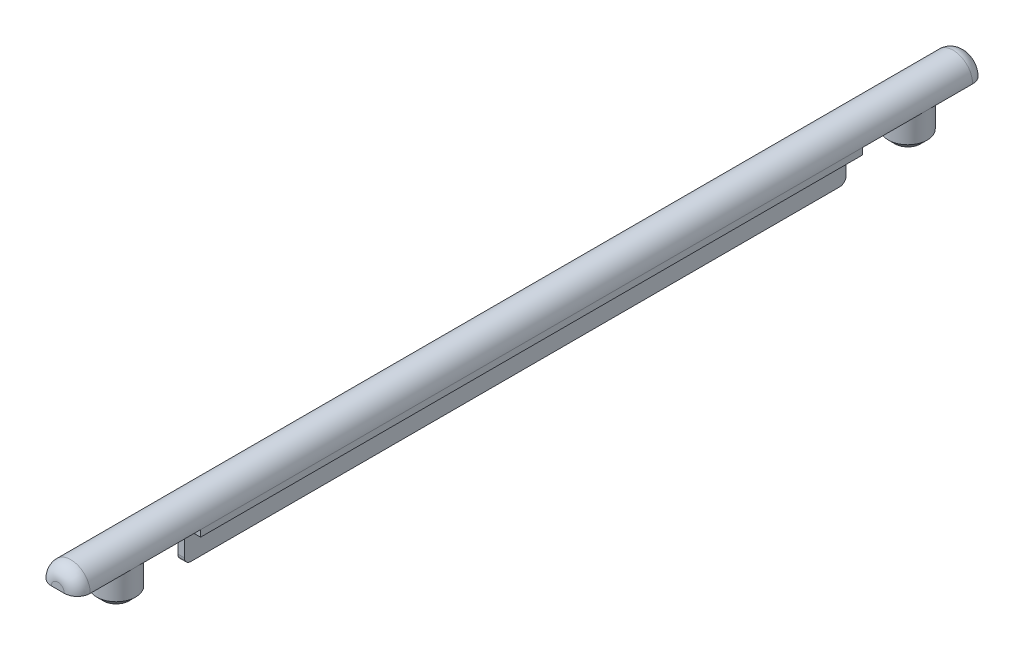
ISO-10303-21;
HEADER;
FILE_DESCRIPTION(('STEP AP214'),'2;1');
FILE_NAME('part.step','',(''),(''),'','','');
FILE_SCHEMA(('AUTOMOTIVE_DESIGN { 1 0 10303 214 1 1 1 1 }'));
ENDSEC;
DATA;
#1=APPLICATION_CONTEXT('core data for automotive mechanical design processes');
#2=APPLICATION_PROTOCOL_DEFINITION('international standard','automotive_design',2000,#1);
#3=PRODUCT_CONTEXT('',#1,'mechanical');
#4=PRODUCT('Part','Part','',(#3));
#5=PRODUCT_RELATED_PRODUCT_CATEGORY('part','',(#4));
#6=PRODUCT_DEFINITION_FORMATION('','',#4);
#7=PRODUCT_DEFINITION_CONTEXT('part definition',#1,'design');
#8=PRODUCT_DEFINITION('design','',#6,#7);
#9=PRODUCT_DEFINITION_SHAPE('','',#8);
#10=(LENGTH_UNIT() NAMED_UNIT(*) SI_UNIT(.MILLI.,.METRE.));
#11=(NAMED_UNIT(*) PLANE_ANGLE_UNIT() SI_UNIT($,.RADIAN.));
#12=(NAMED_UNIT(*) SI_UNIT($,.STERADIAN.) SOLID_ANGLE_UNIT());
#13=UNCERTAINTY_MEASURE_WITH_UNIT(LENGTH_MEASURE(1.E-05),#10,'distance_accuracy_value','');
#14=(GEOMETRIC_REPRESENTATION_CONTEXT(3) GLOBAL_UNCERTAINTY_ASSIGNED_CONTEXT((#13)) GLOBAL_UNIT_ASSIGNED_CONTEXT((#10,
#11,#12)) REPRESENTATION_CONTEXT('',''));
#15=CARTESIAN_POINT('',(0.,0.,0.));
#16=DIRECTION('',(0.,0.,1.));
#17=DIRECTION('',(1.,0.,0.));
#18=AXIS2_PLACEMENT_3D('',#15,#16,#17);
#19=CARTESIAN_POINT('',(-3.,0.,140.));
#20=DIRECTION('',(0.,1.,0.));
#21=DIRECTION('',(0.,0.,1.));
#22=AXIS2_PLACEMENT_3D('',#19,#20,#21);
#23=PLANE('',#22);
#24=DIRECTION('',(0.,0.,-1.));
#25=VECTOR('',#24,1.);
#26=CARTESIAN_POINT('',(-0.499999999999763,0.,121.));
#27=LINE('',#26,#25);
#28=CARTESIAN_POINT('',(-0.499999999999757,0.,121.));
#29=VERTEX_POINT('',#28);
#30=CARTESIAN_POINT('',(-0.499999999999755,0.,19.));
#31=VERTEX_POINT('',#30);
#32=EDGE_CURVE('E173',#29,#31,#27,.T.);
#33=ORIENTED_EDGE('',*,*,#32,.F.);
#34=DIRECTION('',(1.,0.,0.));
#35=VECTOR('',#34,1.);
#36=CARTESIAN_POINT('',(-3.,0.,121.));
#37=LINE('',#36,#35);
#38=CARTESIAN_POINT('',(-3.,0.,121.));
#39=VERTEX_POINT('',#38);
#40=EDGE_CURVE('E167',#39,#29,#37,.T.);
#41=ORIENTED_EDGE('',*,*,#40,.F.);
#42=DIRECTION('',(0.,0.,-1.));
#43=VECTOR('',#42,1.);
#44=CARTESIAN_POINT('',(-3.,0.,140.));
#45=LINE('',#44,#43);
#46=CARTESIAN_POINT('',(-3.,0.,19.));
#47=VERTEX_POINT('',#46);
#48=EDGE_CURVE('E257',#39,#47,#45,.T.);
#49=ORIENTED_EDGE('',*,*,#48,.T.);
#50=DIRECTION('',(-1.,0.,0.));
#51=VECTOR('',#50,1.);
#52=CARTESIAN_POINT('',(3.,0.,19.));
#53=LINE('',#52,#51);
#54=EDGE_CURVE('E197',#31,#47,#53,.T.);
#55=ORIENTED_EDGE('',*,*,#54,.F.);
#56=EDGE_LOOP('',(#33,#41,#49,#55));
#57=FACE_BOUND('',#56,.T.);
#58=ADVANCED_FACE('F33',(#57),#23,.F.);
#59=DIRECTION('',(0.,0.,1.));
#60=VECTOR('',#59,1.);
#61=CARTESIAN_POINT('',(0.500000000000209,0.,121.));
#62=LINE('',#61,#60);
#63=CARTESIAN_POINT('',(0.500000000000216,0.,19.));
#64=VERTEX_POINT('',#63);
#65=CARTESIAN_POINT('',(0.500000000000209,0.,121.));
#66=VERTEX_POINT('',#65);
#67=EDGE_CURVE('E163',#64,#66,#62,.T.);
#68=ORIENTED_EDGE('',*,*,#67,.F.);
#69=CARTESIAN_POINT('',(3.,0.,19.));
#70=VERTEX_POINT('',#69);
#71=EDGE_CURVE('E218',#70,#64,#53,.T.);
#72=ORIENTED_EDGE('',*,*,#71,.F.);
#73=DIRECTION('',(0.,0.,-1.));
#74=VECTOR('',#73,1.);
#75=CARTESIAN_POINT('',(3.,0.,140.));
#76=LINE('',#75,#74);
#77=CARTESIAN_POINT('',(3.,0.,121.));
#78=VERTEX_POINT('',#77);
#79=EDGE_CURVE('E166',#78,#70,#76,.T.);
#80=ORIENTED_EDGE('',*,*,#79,.F.);
#81=EDGE_CURVE('E149',#66,#78,#37,.T.);
#82=ORIENTED_EDGE('',*,*,#81,.F.);
#83=EDGE_LOOP('',(#68,#72,#80,#82));
#84=FACE_BOUND('',#83,.T.);
#85=ADVANCED_FACE('F161',(#84),#23,.F.);
#86=CARTESIAN_POINT('',(0.,1.,0.));
#87=DIRECTION('',(0.,-1.,0.));
#88=DIRECTION('',(0.,0.,-1.));
#89=AXIS2_PLACEMENT_3D('',#86,#87,#88);
#90=PLANE('',#89);
#91=DIRECTION('',(0.,0.,-1.));
#92=VECTOR('',#91,1.);
#93=CARTESIAN_POINT('',(-3.,1.,0.));
#94=LINE('',#93,#92);
#95=CARTESIAN_POINT('',(-3.,1.,19.));
#96=VERTEX_POINT('',#95);
#97=CARTESIAN_POINT('',(-3.,1.,9.00000000000001));
#98=VERTEX_POINT('',#97);
#99=EDGE_CURVE('E198',#96,#98,#94,.T.);
#100=ORIENTED_EDGE('',*,*,#99,.T.);
#101=CARTESIAN_POINT('',(0.,1.,9.00000000000001));
#102=DIRECTION('',(0.,-1.,0.));
#103=DIRECTION('',(0.,0.,-1.));
#104=AXIS2_PLACEMENT_3D('',#101,#102,#103);
#105=CIRCLE('',#104,3.);
#106=CARTESIAN_POINT('',(3.,1.,9.00000000000001));
#107=VERTEX_POINT('',#106);
#108=EDGE_CURVE('E191',#107,#98,#105,.T.);
#109=ORIENTED_EDGE('',*,*,#108,.F.);
#110=DIRECTION('',(0.,0.,1.));
#111=VECTOR('',#110,1.);
#112=CARTESIAN_POINT('',(3.,1.,0.));
#113=LINE('',#112,#111);
#114=CARTESIAN_POINT('',(3.,1.,19.));
#115=VERTEX_POINT('',#114);
#116=EDGE_CURVE('E205',#107,#115,#113,.T.);
#117=ORIENTED_EDGE('',*,*,#116,.T.);
#118=DIRECTION('',(-1.,0.,0.));
#119=VECTOR('',#118,1.);
#120=CARTESIAN_POINT('',(3.,1.,19.));
#121=LINE('',#120,#119);
#122=EDGE_CURVE('E208',#115,#96,#121,.T.);
#123=ORIENTED_EDGE('',*,*,#122,.T.);
#124=EDGE_LOOP('',(#100,#109,#117,#123));
#125=FACE_BOUND('',#124,.T.);
#126=ADVANCED_FACE('F337',(#125),#90,.T.);
#127=CARTESIAN_POINT('',(-3.,1.,2.));
#128=VERTEX_POINT('',#127);
#129=EDGE_CURVE('E202',#98,#128,#94,.T.);
#130=ORIENTED_EDGE('',*,*,#129,.T.);
#131=CARTESIAN_POINT('',(-1.,1.,2.));
#132=DIRECTION('',(0.,-1.,0.));
#133=DIRECTION('',(0.,0.,-1.));
#134=AXIS2_PLACEMENT_3D('',#131,#132,#133);
#135=CIRCLE('',#134,2.);
#136=CARTESIAN_POINT('',(-1.,1.,0.));
#137=VERTEX_POINT('',#136);
#138=EDGE_CURVE('E223',#128,#137,#135,.T.);
#139=ORIENTED_EDGE('',*,*,#138,.T.);
#140=DIRECTION('',(1.,0.,0.));
#141=VECTOR('',#140,1.);
#142=CARTESIAN_POINT('',(3.,1.,0.));
#143=LINE('',#142,#141);
#144=CARTESIAN_POINT('',(1.,1.,0.));
#145=VERTEX_POINT('',#144);
#146=EDGE_CURVE('E201',#137,#145,#143,.T.);
#147=ORIENTED_EDGE('',*,*,#146,.T.);
#148=CARTESIAN_POINT('',(1.,1.,2.));
#149=DIRECTION('',(0.,-1.,0.));
#150=DIRECTION('',(0.,0.,-1.));
#151=AXIS2_PLACEMENT_3D('',#148,#149,#150);
#152=CIRCLE('',#151,2.);
#153=CARTESIAN_POINT('',(3.,1.,2.));
#154=VERTEX_POINT('',#153);
#155=EDGE_CURVE('E225',#145,#154,#152,.T.);
#156=ORIENTED_EDGE('',*,*,#155,.T.);
#157=EDGE_CURVE('E206',#154,#107,#113,.T.);
#158=ORIENTED_EDGE('',*,*,#157,.T.);
#159=CARTESIAN_POINT('',(0.,1.,9.00000000000001));
#160=DIRECTION('',(0.,-1.,0.));
#161=DIRECTION('',(0.,0.,-1.));
#162=AXIS2_PLACEMENT_3D('',#159,#160,#161);
#163=CIRCLE('',#162,3.);
#164=EDGE_CURVE('E251',#107,#98,#163,.F.);
#165=ORIENTED_EDGE('',*,*,#164,.T.);
#166=EDGE_LOOP('',(#130,#139,#147,#156,#158,#165));
#167=FACE_BOUND('',#166,.T.);
#168=ADVANCED_FACE('F370',(#167),#90,.T.);
#169=CARTESIAN_POINT('',(0.,1.,0.));
#170=DIRECTION('',(0.,-1.,0.));
#171=DIRECTION('',(0.,0.,-1.));
#172=AXIS2_PLACEMENT_3D('',#169,#170,#171);
#173=PLANE('',#172);
#174=DIRECTION('',(-1.,0.,0.));
#175=VECTOR('',#174,1.);
#176=CARTESIAN_POINT('',(-3.,1.,140.));
#177=LINE('',#176,#175);
#178=CARTESIAN_POINT('',(0.999999999999999,1.,140.));
#179=VERTEX_POINT('',#178);
#180=CARTESIAN_POINT('',(-1.,1.,140.));
#181=VERTEX_POINT('',#180);
#182=EDGE_CURVE('E278',#179,#181,#177,.T.);
#183=ORIENTED_EDGE('',*,*,#182,.T.);
#184=CARTESIAN_POINT('',(-1.,1.,138.));
#185=DIRECTION('',(0.,-1.,0.));
#186=DIRECTION('',(0.,0.,-1.));
#187=AXIS2_PLACEMENT_3D('',#184,#185,#186);
#188=CIRCLE('',#187,2.);
#189=CARTESIAN_POINT('',(-3.,1.,138.));
#190=VERTEX_POINT('',#189);
#191=EDGE_CURVE('E232',#181,#190,#188,.T.);
#192=ORIENTED_EDGE('',*,*,#191,.T.);
#193=DIRECTION('',(0.,0.,-1.));
#194=VECTOR('',#193,1.);
#195=CARTESIAN_POINT('',(-3.,1.,140.));
#196=LINE('',#195,#194);
#197=CARTESIAN_POINT('',(-3.,1.,131.));
#198=VERTEX_POINT('',#197);
#199=EDGE_CURVE('E265',#190,#198,#196,.T.);
#200=ORIENTED_EDGE('',*,*,#199,.T.);
#201=CARTESIAN_POINT('',(0.,1.,131.));
#202=DIRECTION('',(0.,-1.,0.));
#203=DIRECTION('',(0.,0.,-1.));
#204=AXIS2_PLACEMENT_3D('',#201,#202,#203);
#205=CIRCLE('',#204,3.);
#206=CARTESIAN_POINT('',(3.,1.,131.));
#207=VERTEX_POINT('',#206);
#208=EDGE_CURVE('E193',#207,#198,#205,.T.);
#209=ORIENTED_EDGE('',*,*,#208,.F.);
#210=DIRECTION('',(0.,0.,-1.));
#211=VECTOR('',#210,1.);
#212=CARTESIAN_POINT('',(3.,1.,140.));
#213=LINE('',#212,#211);
#214=CARTESIAN_POINT('',(3.,1.,138.));
#215=VERTEX_POINT('',#214);
#216=EDGE_CURVE('E261',#215,#207,#213,.T.);
#217=ORIENTED_EDGE('',*,*,#216,.F.);
#218=CARTESIAN_POINT('',(1.,1.,138.));
#219=DIRECTION('',(0.,-1.,0.));
#220=DIRECTION('',(0.,0.,-1.));
#221=AXIS2_PLACEMENT_3D('',#218,#219,#220);
#222=CIRCLE('',#221,2.);
#223=EDGE_CURVE('E234',#215,#179,#222,.T.);
#224=ORIENTED_EDGE('',*,*,#223,.T.);
#225=EDGE_LOOP('',(#183,#192,#200,#209,#217,#224));
#226=FACE_BOUND('',#225,.T.);
#227=ADVANCED_FACE('F415',(#226),#173,.T.);
#228=CARTESIAN_POINT('',(3.,1.,121.));
#229=VERTEX_POINT('',#228);
#230=EDGE_CURVE('E263',#207,#229,#213,.T.);
#231=ORIENTED_EDGE('',*,*,#230,.F.);
#232=CARTESIAN_POINT('',(0.,1.,131.));
#233=DIRECTION('',(0.,-1.,0.));
#234=DIRECTION('',(0.,0.,-1.));
#235=AXIS2_PLACEMENT_3D('',#232,#233,#234);
#236=CIRCLE('',#235,3.);
#237=EDGE_CURVE('E254',#207,#198,#236,.F.);
#238=ORIENTED_EDGE('',*,*,#237,.T.);
#239=CARTESIAN_POINT('',(-3.,1.,121.));
#240=VERTEX_POINT('',#239);
#241=EDGE_CURVE('E267',#198,#240,#196,.T.);
#242=ORIENTED_EDGE('',*,*,#241,.T.);
#243=DIRECTION('',(1.,0.,0.));
#244=VECTOR('',#243,1.);
#245=CARTESIAN_POINT('',(-3.,1.,121.));
#246=LINE('',#245,#244);
#247=EDGE_CURVE('E272',#240,#229,#246,.T.);
#248=ORIENTED_EDGE('',*,*,#247,.T.);
#249=EDGE_LOOP('',(#231,#238,#242,#248));
#250=FACE_BOUND('',#249,.T.);
#251=ADVANCED_FACE('F388',(#250),#173,.T.);
#252=CARTESIAN_POINT('',(0.,1.,0.));
#253=DIRECTION('',(0.,0.,1.));
#254=DIRECTION('',(1.,0.,0.));
#255=AXIS2_PLACEMENT_3D('',#252,#253,#254);
#256=PLANE('',#255);
#257=ORIENTED_EDGE('',*,*,#146,.F.);
#258=CARTESIAN_POINT('',(0.,1.,0.));
#259=DIRECTION('',(0.,0.,1.));
#260=DIRECTION('',(1.,0.,0.));
#261=AXIS2_PLACEMENT_3D('',#258,#259,#260);
#262=CIRCLE('',#261,1.);
#263=EDGE_CURVE('E220',#137,#145,#262,.F.);
#264=ORIENTED_EDGE('',*,*,#263,.T.);
#265=EDGE_LOOP('',(#257,#264));
#266=FACE_BOUND('',#265,.T.);
#267=ADVANCED_FACE('F422',(#266),#256,.F.);
#268=CARTESIAN_POINT('',(0.,1.,140.));
#269=DIRECTION('',(0.,0.,1.));
#270=DIRECTION('',(1.,0.,0.));
#271=AXIS2_PLACEMENT_3D('',#268,#269,#270);
#272=PLANE('',#271);
#273=ORIENTED_EDGE('',*,*,#182,.F.);
#274=CARTESIAN_POINT('',(0.,1.,140.));
#275=DIRECTION('',(0.,0.,1.));
#276=DIRECTION('',(1.,0.,0.));
#277=AXIS2_PLACEMENT_3D('',#274,#275,#276);
#278=CIRCLE('',#277,1.);
#279=EDGE_CURVE('E236',#179,#181,#278,.T.);
#280=ORIENTED_EDGE('',*,*,#279,.T.);
#281=EDGE_LOOP('',(#273,#280));
#282=FACE_BOUND('',#281,.T.);
#283=ADVANCED_FACE('F344',(#282),#272,.T.);
#284=CARTESIAN_POINT('',(-3.,0.,140.));
#285=DIRECTION('',(1.,0.,0.));
#286=DIRECTION('',(0.,0.,-1.));
#287=AXIS2_PLACEMENT_3D('',#284,#285,#286);
#288=PLANE('',#287);
#289=EDGE_CURVE('E268',#240,#96,#196,.T.);
#290=ORIENTED_EDGE('',*,*,#289,.T.);
#291=DIRECTION('',(0.,-1.,0.));
#292=VECTOR('',#291,1.);
#293=CARTESIAN_POINT('',(-3.,1.,19.));
#294=LINE('',#293,#292);
#295=EDGE_CURVE('E168',#96,#47,#294,.T.);
#296=ORIENTED_EDGE('',*,*,#295,.T.);
#297=ORIENTED_EDGE('',*,*,#48,.F.);
#298=DIRECTION('',(0.,-1.,0.));
#299=VECTOR('',#298,1.);
#300=CARTESIAN_POINT('',(-3.,1.,121.));
#301=LINE('',#300,#299);
#302=EDGE_CURVE('E269',#240,#39,#301,.T.);
#303=ORIENTED_EDGE('',*,*,#302,.F.);
#304=EDGE_LOOP('',(#290,#296,#297,#303));
#305=FACE_BOUND('',#304,.T.);
#306=ADVANCED_FACE('F290',(#305),#288,.F.);
#307=CARTESIAN_POINT('',(3.,0.,140.));
#308=DIRECTION('',(-1.,0.,0.));
#309=DIRECTION('',(0.,0.,1.));
#310=AXIS2_PLACEMENT_3D('',#307,#308,#309);
#311=PLANE('',#310);
#312=ORIENTED_EDGE('',*,*,#79,.T.);
#313=DIRECTION('',(0.,-1.,0.));
#314=VECTOR('',#313,1.);
#315=CARTESIAN_POINT('',(3.,1.,19.));
#316=LINE('',#315,#314);
#317=EDGE_CURVE('E211',#115,#70,#316,.T.);
#318=ORIENTED_EDGE('',*,*,#317,.F.);
#319=EDGE_CURVE('E264',#229,#115,#213,.T.);
#320=ORIENTED_EDGE('',*,*,#319,.F.);
#321=DIRECTION('',(0.,-1.,0.));
#322=VECTOR('',#321,1.);
#323=CARTESIAN_POINT('',(3.,1.,121.));
#324=LINE('',#323,#322);
#325=EDGE_CURVE('E271',#229,#78,#324,.T.);
#326=ORIENTED_EDGE('',*,*,#325,.T.);
#327=EDGE_LOOP('',(#312,#318,#320,#326));
#328=FACE_BOUND('',#327,.T.);
#329=ADVANCED_FACE('F340',(#328),#311,.F.);
#330=CARTESIAN_POINT('',(0.,1.,140.));
#331=DIRECTION('',(0.,0.,-1.));
#332=DIRECTION('',(-1.,0.,0.));
#333=AXIS2_PLACEMENT_3D('',#330,#331,#332);
#334=CYLINDRICAL_SURFACE('',#333,3.);
#335=ORIENTED_EDGE('',*,*,#199,.F.);
#336=CARTESIAN_POINT('',(0.,1.,138.));
#337=DIRECTION('',(0.,0.,1.));
#338=DIRECTION('',(1.,0.,0.));
#339=AXIS2_PLACEMENT_3D('',#336,#337,#338);
#340=CIRCLE('',#339,3.);
#341=EDGE_CURVE('E227',#190,#215,#340,.F.);
#342=ORIENTED_EDGE('',*,*,#341,.T.);
#343=ORIENTED_EDGE('',*,*,#216,.T.);
#344=ORIENTED_EDGE('',*,*,#230,.T.);
#345=ORIENTED_EDGE('',*,*,#319,.T.);
#346=ORIENTED_EDGE('',*,*,#116,.F.);
#347=ORIENTED_EDGE('',*,*,#157,.F.);
#348=CARTESIAN_POINT('',(0.,1.,2.));
#349=DIRECTION('',(0.,0.,1.));
#350=DIRECTION('',(1.,0.,0.));
#351=AXIS2_PLACEMENT_3D('',#348,#349,#350);
#352=CIRCLE('',#351,3.);
#353=EDGE_CURVE('E229',#154,#128,#352,.T.);
#354=ORIENTED_EDGE('',*,*,#353,.T.);
#355=ORIENTED_EDGE('',*,*,#129,.F.);
#356=ORIENTED_EDGE('',*,*,#99,.F.);
#357=ORIENTED_EDGE('',*,*,#289,.F.);
#358=ORIENTED_EDGE('',*,*,#241,.F.);
#359=EDGE_LOOP('',(#335,#342,#343,#344,#345,#346,#347,#354,#355,#356,#357,#358));
#360=FACE_BOUND('',#359,.T.);
#361=ADVANCED_FACE('F376',(#360),#334,.T.);
#362=CARTESIAN_POINT('',(-3.,1.,121.));
#363=DIRECTION('',(0.,0.,-1.));
#364=DIRECTION('',(-1.,0.,0.));
#365=AXIS2_PLACEMENT_3D('',#362,#363,#364);
#366=PLANE('',#365);
#367=DIRECTION('',(0.,1.,0.));
#368=VECTOR('',#367,1.);
#369=CARTESIAN_POINT('',(-0.499999999999763,-5.,121.));
#370=LINE('',#369,#368);
#371=CARTESIAN_POINT('',(-0.499999999999763,-4.,121.));
#372=VERTEX_POINT('',#371);
#373=EDGE_CURVE('E156',#372,#29,#370,.T.);
#374=ORIENTED_EDGE('',*,*,#373,.F.);
#375=DIRECTION('',(-1.,0.,0.));
#376=VECTOR('',#375,1.);
#377=CARTESIAN_POINT('',(0.500000000000209,-4.,121.));
#378=LINE('',#377,#376);
#379=CARTESIAN_POINT('',(0.500000000000209,-4.,121.));
#380=VERTEX_POINT('',#379);
#381=EDGE_CURVE('E11',#372,#380,#378,.F.);
#382=ORIENTED_EDGE('',*,*,#381,.T.);
#383=DIRECTION('',(0.,1.,0.));
#384=VECTOR('',#383,1.);
#385=CARTESIAN_POINT('',(0.500000000000209,-5.,121.));
#386=LINE('',#385,#384);
#387=EDGE_CURVE('E145',#380,#66,#386,.T.);
#388=ORIENTED_EDGE('',*,*,#387,.T.);
#389=ORIENTED_EDGE('',*,*,#81,.T.);
#390=ORIENTED_EDGE('',*,*,#325,.F.);
#391=ORIENTED_EDGE('',*,*,#247,.F.);
#392=ORIENTED_EDGE('',*,*,#302,.T.);
#393=ORIENTED_EDGE('',*,*,#40,.T.);
#394=EDGE_LOOP('',(#374,#382,#388,#389,#390,#391,#392,#393));
#395=FACE_BOUND('',#394,.T.);
#396=ADVANCED_FACE('F147',(#395),#366,.F.);
#397=CARTESIAN_POINT('',(3.,1.,19.));
#398=DIRECTION('',(0.,0.,1.));
#399=DIRECTION('',(1.,0.,0.));
#400=AXIS2_PLACEMENT_3D('',#397,#398,#399);
#401=PLANE('',#400);
#402=DIRECTION('',(0.,1.,0.));
#403=VECTOR('',#402,1.);
#404=CARTESIAN_POINT('',(0.500000000000221,-5.,19.));
#405=LINE('',#404,#403);
#406=CARTESIAN_POINT('',(0.500000000000221,-4.,19.));
#407=VERTEX_POINT('',#406);
#408=EDGE_CURVE('E155',#407,#64,#405,.T.);
#409=ORIENTED_EDGE('',*,*,#408,.F.);
#410=DIRECTION('',(1.,0.,0.));
#411=VECTOR('',#410,1.);
#412=CARTESIAN_POINT('',(-0.499999999999751,-4.,19.));
#413=LINE('',#412,#411);
#414=CARTESIAN_POINT('',(-0.499999999999751,-4.,19.));
#415=VERTEX_POINT('',#414);
#416=EDGE_CURVE('E56',#407,#415,#413,.F.);
#417=ORIENTED_EDGE('',*,*,#416,.T.);
#418=DIRECTION('',(0.,1.,0.));
#419=VECTOR('',#418,1.);
#420=CARTESIAN_POINT('',(-0.499999999999751,-5.,19.));
#421=LINE('',#420,#419);
#422=EDGE_CURVE('E194',#415,#31,#421,.T.);
#423=ORIENTED_EDGE('',*,*,#422,.T.);
#424=ORIENTED_EDGE('',*,*,#54,.T.);
#425=ORIENTED_EDGE('',*,*,#295,.F.);
#426=ORIENTED_EDGE('',*,*,#122,.F.);
#427=ORIENTED_EDGE('',*,*,#317,.T.);
#428=ORIENTED_EDGE('',*,*,#71,.T.);
#429=EDGE_LOOP('',(#409,#417,#423,#424,#425,#426,#427,#428));
#430=FACE_BOUND('',#429,.T.);
#431=ADVANCED_FACE('F383',(#430),#401,.F.);
#432=CARTESIAN_POINT('',(0.,-4.,131.));
#433=DIRECTION('',(0.,1.,0.));
#434=DIRECTION('',(0.,0.,1.));
#435=AXIS2_PLACEMENT_3D('',#432,#433,#434);
#436=CYLINDRICAL_SURFACE('',#435,3.);
#437=CARTESIAN_POINT('',(0.,-3.,131.));
#438=DIRECTION('',(0.,-1.,0.));
#439=DIRECTION('',(0.,0.,-1.));
#440=AXIS2_PLACEMENT_3D('',#437,#438,#439);
#441=CIRCLE('',#440,3.);
#442=CARTESIAN_POINT('',(0.,-3.,128.));
#443=VERTEX_POINT('',#442);
#444=EDGE_CURVE('E245',#443,#443,#441,.F.);
#445=ORIENTED_EDGE('',*,*,#444,.T.);
#446=EDGE_LOOP('',(#445));
#447=FACE_BOUND('',#446,.T.);
#448=ORIENTED_EDGE('',*,*,#208,.T.);
#449=ORIENTED_EDGE('',*,*,#237,.F.);
#450=EDGE_LOOP('',(#448,#449));
#451=FACE_BOUND('',#450,.T.);
#452=ADVANCED_FACE('F404',(#447,#451),#436,.T.);
#453=CARTESIAN_POINT('',(0.,-4.,131.));
#454=DIRECTION('',(0.,-1.,0.));
#455=DIRECTION('',(0.,0.,-1.));
#456=AXIS2_PLACEMENT_3D('',#453,#454,#455);
#457=PLANE('',#456);
#458=CARTESIAN_POINT('',(0.,-4.,131.));
#459=DIRECTION('',(0.,-1.,0.));
#460=DIRECTION('',(0.,0.,-1.));
#461=AXIS2_PLACEMENT_3D('',#458,#459,#460);
#462=CIRCLE('',#461,2.);
#463=CARTESIAN_POINT('',(0.,-4.,129.));
#464=VERTEX_POINT('',#463);
#465=EDGE_CURVE('E248',#464,#464,#462,.T.);
#466=ORIENTED_EDGE('',*,*,#465,.T.);
#467=EDGE_LOOP('',(#466));
#468=FACE_BOUND('',#467,.T.);
#469=ADVANCED_FACE('F395',(#468),#457,.T.);
#470=CARTESIAN_POINT('',(0.,-4.,9.00000000000001));
#471=DIRECTION('',(0.,1.,0.));
#472=DIRECTION('',(0.,0.,1.));
#473=AXIS2_PLACEMENT_3D('',#470,#471,#472);
#474=CYLINDRICAL_SURFACE('',#473,3.);
#475=CARTESIAN_POINT('',(0.,-3.,9.00000000000001));
#476=DIRECTION('',(0.,-1.,0.));
#477=DIRECTION('',(0.,0.,-1.));
#478=AXIS2_PLACEMENT_3D('',#475,#476,#477);
#479=CIRCLE('',#478,3.);
#480=CARTESIAN_POINT('',(0.,-3.,6.00000000000001));
#481=VERTEX_POINT('',#480);
#482=EDGE_CURVE('E239',#481,#481,#479,.F.);
#483=ORIENTED_EDGE('',*,*,#482,.T.);
#484=EDGE_LOOP('',(#483));
#485=FACE_BOUND('',#484,.T.);
#486=ORIENTED_EDGE('',*,*,#108,.T.);
#487=ORIENTED_EDGE('',*,*,#164,.F.);
#488=EDGE_LOOP('',(#486,#487));
#489=FACE_BOUND('',#488,.T.);
#490=ADVANCED_FACE('F393',(#485,#489),#474,.T.);
#491=CARTESIAN_POINT('',(0.,-4.,9.00000000000001));
#492=DIRECTION('',(0.,-1.,0.));
#493=DIRECTION('',(0.,0.,-1.));
#494=AXIS2_PLACEMENT_3D('',#491,#492,#493);
#495=PLANE('',#494);
#496=CARTESIAN_POINT('',(0.,-4.,9.00000000000001));
#497=DIRECTION('',(0.,-1.,0.));
#498=DIRECTION('',(0.,0.,-1.));
#499=AXIS2_PLACEMENT_3D('',#496,#497,#498);
#500=CIRCLE('',#499,2.);
#501=CARTESIAN_POINT('',(0.,-4.,7.00000000000001));
#502=VERTEX_POINT('',#501);
#503=EDGE_CURVE('E242',#502,#502,#500,.T.);
#504=ORIENTED_EDGE('',*,*,#503,.T.);
#505=EDGE_LOOP('',(#504));
#506=FACE_BOUND('',#505,.T.);
#507=ADVANCED_FACE('F349',(#506),#495,.T.);
#508=CARTESIAN_POINT('',(0.,-4.,131.));
#509=DIRECTION('',(0.,1.,0.));
#510=DIRECTION('',(0.,0.,1.));
#511=AXIS2_PLACEMENT_3D('',#508,#509,#510);
#512=CONICAL_SURFACE('',#511,2.,0.785398163397447);
#513=ORIENTED_EDGE('',*,*,#444,.F.);
#514=EDGE_LOOP('',(#513));
#515=FACE_BOUND('',#514,.T.);
#516=ORIENTED_EDGE('',*,*,#465,.F.);
#517=EDGE_LOOP('',(#516));
#518=FACE_BOUND('',#517,.T.);
#519=ADVANCED_FACE('F345',(#515,#518),#512,.T.);
#520=CARTESIAN_POINT('',(0.,-4.,9.00000000000001));
#521=DIRECTION('',(0.,1.,0.));
#522=DIRECTION('',(0.,0.,1.));
#523=AXIS2_PLACEMENT_3D('',#520,#521,#522);
#524=CONICAL_SURFACE('',#523,2.,0.78539816339745);
#525=ORIENTED_EDGE('',*,*,#482,.F.);
#526=EDGE_LOOP('',(#525));
#527=FACE_BOUND('',#526,.T.);
#528=ORIENTED_EDGE('',*,*,#503,.F.);
#529=EDGE_LOOP('',(#528));
#530=FACE_BOUND('',#529,.T.);
#531=ADVANCED_FACE('F348',(#527,#530),#524,.T.);
#532=CARTESIAN_POINT('',(0.,1.,138.));
#533=DIRECTION('',(0.,0.,1.));
#534=DIRECTION('',(1.,0.,0.));
#535=AXIS2_PLACEMENT_3D('',#532,#533,#534);
#536=DEGENERATE_TOROIDAL_SURFACE('',#535,1.,2.,.T.);
#537=ORIENTED_EDGE('',*,*,#223,.F.);
#538=ORIENTED_EDGE('',*,*,#341,.F.);
#539=ORIENTED_EDGE('',*,*,#191,.F.);
#540=ORIENTED_EDGE('',*,*,#279,.F.);
#541=EDGE_LOOP('',(#537,#538,#539,#540));
#542=FACE_BOUND('',#541,.T.);
#543=ADVANCED_FACE('F353',(#542),#536,.T.);
#544=CARTESIAN_POINT('',(0.,1.,2.));
#545=DIRECTION('',(0.,0.,1.));
#546=DIRECTION('',(1.,0.,0.));
#547=AXIS2_PLACEMENT_3D('',#544,#545,#546);
#548=DEGENERATE_TOROIDAL_SURFACE('',#547,1.,2.,.T.);
#549=ORIENTED_EDGE('',*,*,#155,.F.);
#550=ORIENTED_EDGE('',*,*,#263,.F.);
#551=ORIENTED_EDGE('',*,*,#138,.F.);
#552=ORIENTED_EDGE('',*,*,#353,.F.);
#553=EDGE_LOOP('',(#549,#550,#551,#552));
#554=FACE_BOUND('',#553,.T.);
#555=ADVANCED_FACE('F356',(#554),#548,.T.);
#556=CARTESIAN_POINT('',(-0.499999999999763,-5.,121.));
#557=DIRECTION('',(1.,0.,0.));
#558=DIRECTION('',(0.,0.,-1.));
#559=AXIS2_PLACEMENT_3D('',#556,#557,#558);
#560=PLANE('',#559);
#561=ORIENTED_EDGE('',*,*,#422,.F.);
#562=CARTESIAN_POINT('',(-0.499999999999751,-4.,20.));
#563=DIRECTION('',(1.,0.,0.));
#564=DIRECTION('',(0.,0.,-1.));
#565=AXIS2_PLACEMENT_3D('',#562,#563,#564);
#566=CIRCLE('',#565,1.);
#567=CARTESIAN_POINT('',(-0.499999999999751,-5.,20.));
#568=VERTEX_POINT('',#567);
#569=EDGE_CURVE('E41',#415,#568,#566,.F.);
#570=ORIENTED_EDGE('',*,*,#569,.T.);
#571=DIRECTION('',(0.,0.,-1.));
#572=VECTOR('',#571,1.);
#573=CARTESIAN_POINT('',(-0.499999999999763,-5.,121.));
#574=LINE('',#573,#572);
#575=CARTESIAN_POINT('',(-0.499999999999763,-5.,120.));
#576=VERTEX_POINT('',#575);
#577=EDGE_CURVE('E172',#576,#568,#574,.T.);
#578=ORIENTED_EDGE('',*,*,#577,.F.);
#579=CARTESIAN_POINT('',(-0.499999999999763,-4.,120.));
#580=DIRECTION('',(1.,0.,0.));
#581=DIRECTION('',(0.,0.,-1.));
#582=AXIS2_PLACEMENT_3D('',#579,#580,#581);
#583=CIRCLE('',#582,1.);
#584=EDGE_CURVE('E48',#576,#372,#583,.F.);
#585=ORIENTED_EDGE('',*,*,#584,.T.);
#586=ORIENTED_EDGE('',*,*,#373,.T.);
#587=ORIENTED_EDGE('',*,*,#32,.T.);
#588=EDGE_LOOP('',(#561,#570,#578,#585,#586,#587));
#589=FACE_BOUND('',#588,.T.);
#590=ADVANCED_FACE('F296',(#589),#560,.F.);
#591=CARTESIAN_POINT('',(0.500000000000209,-5.,121.));
#592=DIRECTION('',(-1.,0.,0.));
#593=DIRECTION('',(0.,0.,1.));
#594=AXIS2_PLACEMENT_3D('',#591,#592,#593);
#595=PLANE('',#594);
#596=DIRECTION('',(0.,0.,1.));
#597=VECTOR('',#596,1.);
#598=CARTESIAN_POINT('',(0.500000000000209,-5.,121.));
#599=LINE('',#598,#597);
#600=CARTESIAN_POINT('',(0.500000000000221,-5.,20.));
#601=VERTEX_POINT('',#600);
#602=CARTESIAN_POINT('',(0.500000000000209,-5.,120.));
#603=VERTEX_POINT('',#602);
#604=EDGE_CURVE('E176',#601,#603,#599,.T.);
#605=ORIENTED_EDGE('',*,*,#604,.F.);
#606=CARTESIAN_POINT('',(0.500000000000221,-4.,20.));
#607=DIRECTION('',(-1.,0.,0.));
#608=DIRECTION('',(0.,0.,1.));
#609=AXIS2_PLACEMENT_3D('',#606,#607,#608);
#610=CIRCLE('',#609,1.);
#611=EDGE_CURVE('E317',#601,#407,#610,.F.);
#612=ORIENTED_EDGE('',*,*,#611,.T.);
#613=ORIENTED_EDGE('',*,*,#408,.T.);
#614=ORIENTED_EDGE('',*,*,#67,.T.);
#615=ORIENTED_EDGE('',*,*,#387,.F.);
#616=CARTESIAN_POINT('',(0.500000000000209,-4.,120.));
#617=DIRECTION('',(-1.,0.,0.));
#618=DIRECTION('',(0.,0.,1.));
#619=AXIS2_PLACEMENT_3D('',#616,#617,#618);
#620=CIRCLE('',#619,1.);
#621=EDGE_CURVE('E311',#380,#603,#620,.F.);
#622=ORIENTED_EDGE('',*,*,#621,.T.);
#623=EDGE_LOOP('',(#605,#612,#613,#614,#615,#622));
#624=FACE_BOUND('',#623,.T.);
#625=ADVANCED_FACE('F171',(#624),#595,.F.);
#626=CARTESIAN_POINT('',(0.,-5.,0.));
#627=DIRECTION('',(0.,-1.,0.));
#628=DIRECTION('',(0.,0.,-1.));
#629=AXIS2_PLACEMENT_3D('',#626,#627,#628);
#630=PLANE('',#629);
#631=ORIENTED_EDGE('',*,*,#577,.T.);
#632=DIRECTION('',(1.,0.,0.));
#633=VECTOR('',#632,1.);
#634=CARTESIAN_POINT('',(0.500000000000221,-5.,20.));
#635=LINE('',#634,#633);
#636=EDGE_CURVE('E309',#568,#601,#635,.T.);
#637=ORIENTED_EDGE('',*,*,#636,.T.);
#638=ORIENTED_EDGE('',*,*,#604,.T.);
#639=DIRECTION('',(-1.,0.,0.));
#640=VECTOR('',#639,1.);
#641=CARTESIAN_POINT('',(-0.499999999999763,-5.,120.));
#642=LINE('',#641,#640);
#643=EDGE_CURVE('E222',#603,#576,#642,.T.);
#644=ORIENTED_EDGE('',*,*,#643,.T.);
#645=EDGE_LOOP('',(#631,#637,#638,#644));
#646=FACE_BOUND('',#645,.T.);
#647=ADVANCED_FACE('F321',(#646),#630,.T.);
#648=CARTESIAN_POINT('',(0.,-4.,20.));
#649=DIRECTION('',(-1.,0.,0.));
#650=DIRECTION('',(0.,0.,1.));
#651=AXIS2_PLACEMENT_3D('',#648,#649,#650);
#652=CYLINDRICAL_SURFACE('',#651,1.);
#653=ORIENTED_EDGE('',*,*,#569,.F.);
#654=ORIENTED_EDGE('',*,*,#416,.F.);
#655=ORIENTED_EDGE('',*,*,#611,.F.);
#656=ORIENTED_EDGE('',*,*,#636,.F.);
#657=EDGE_LOOP('',(#653,#654,#655,#656));
#658=FACE_BOUND('',#657,.T.);
#659=ADVANCED_FACE('F324',(#658),#652,.T.);
#660=CARTESIAN_POINT('',(0.,-4.,120.));
#661=DIRECTION('',(1.,0.,0.));
#662=DIRECTION('',(0.,0.,-1.));
#663=AXIS2_PLACEMENT_3D('',#660,#661,#662);
#664=CYLINDRICAL_SURFACE('',#663,1.);
#665=ORIENTED_EDGE('',*,*,#621,.F.);
#666=ORIENTED_EDGE('',*,*,#381,.F.);
#667=ORIENTED_EDGE('',*,*,#584,.F.);
#668=ORIENTED_EDGE('',*,*,#643,.F.);
#669=EDGE_LOOP('',(#665,#666,#667,#668));
#670=FACE_BOUND('',#669,.T.);
#671=ADVANCED_FACE('F35',(#670),#664,.T.);
#672=CLOSED_SHELL('',(#58,#85,#126,#168,#227,#251,#267,#283,#306,#329,#361,#396,#431,#452,#469,
#490,#507,#519,#531,#543,#555,#590,#625,#647,#659,#671));
#673=MANIFOLD_SOLID_BREP('B2',#672);
#674=ADVANCED_BREP_SHAPE_REPRESENTATION('',(#18,#673),#14);
#675=SHAPE_DEFINITION_REPRESENTATION(#9,#674);
ENDSEC;
END-ISO-10303-21;
